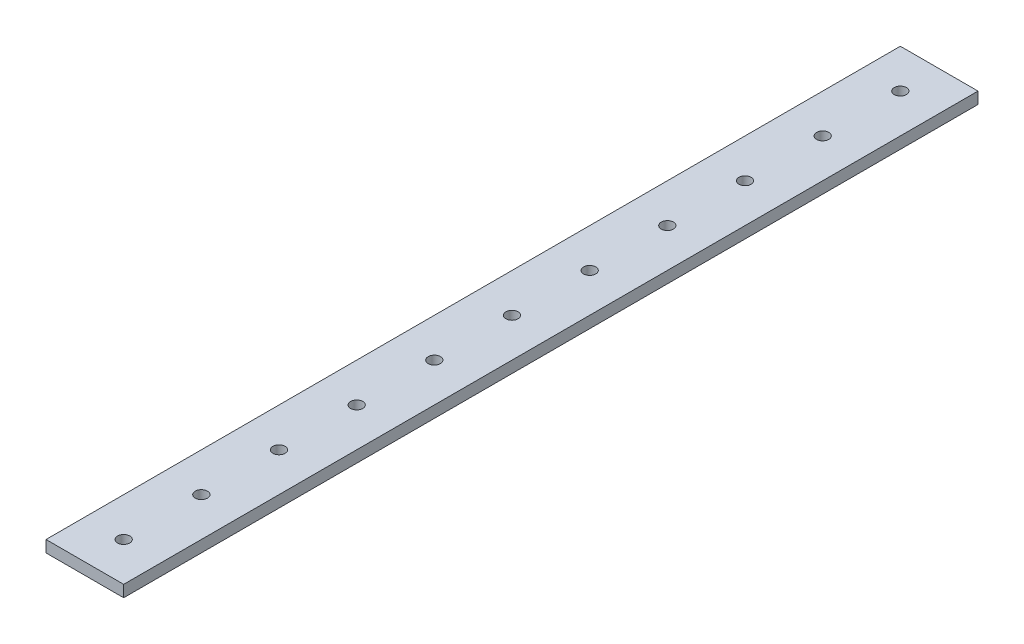
ISO-10303-21;
HEADER;
FILE_DESCRIPTION(('STEP AP214'),'2;1');
FILE_NAME('part.step','',(''),(''),'','','');
FILE_SCHEMA(('AUTOMOTIVE_DESIGN { 1 0 10303 214 1 1 1 1 }'));
ENDSEC;
DATA;
#1=APPLICATION_CONTEXT('core data for automotive mechanical design processes');
#2=APPLICATION_PROTOCOL_DEFINITION('international standard','automotive_design',2000,#1);
#3=PRODUCT_CONTEXT('',#1,'mechanical');
#4=PRODUCT('Part','Part','',(#3));
#5=PRODUCT_RELATED_PRODUCT_CATEGORY('part','',(#4));
#6=PRODUCT_DEFINITION_FORMATION('','',#4);
#7=PRODUCT_DEFINITION_CONTEXT('part definition',#1,'design');
#8=PRODUCT_DEFINITION('design','',#6,#7);
#9=PRODUCT_DEFINITION_SHAPE('','',#8);
#10=(LENGTH_UNIT() NAMED_UNIT(*) SI_UNIT(.MILLI.,.METRE.));
#11=(NAMED_UNIT(*) PLANE_ANGLE_UNIT() SI_UNIT($,.RADIAN.));
#12=(NAMED_UNIT(*) SI_UNIT($,.STERADIAN.) SOLID_ANGLE_UNIT());
#13=UNCERTAINTY_MEASURE_WITH_UNIT(LENGTH_MEASURE(1.E-05),#10,'distance_accuracy_value','');
#14=(GEOMETRIC_REPRESENTATION_CONTEXT(3) GLOBAL_UNCERTAINTY_ASSIGNED_CONTEXT((#13)) GLOBAL_UNIT_ASSIGNED_CONTEXT((#10,
#11,#12)) REPRESENTATION_CONTEXT('',''));
#15=CARTESIAN_POINT('',(0.,0.,0.));
#16=DIRECTION('',(0.,0.,1.));
#17=DIRECTION('',(1.,0.,0.));
#18=AXIS2_PLACEMENT_3D('',#15,#16,#17);
#19=CARTESIAN_POINT('',(0.,0.,220.));
#20=DIRECTION('',(1.,0.,0.));
#21=DIRECTION('',(0.,1.,0.));
#22=AXIS2_PLACEMENT_3D('',#19,#20,#21);
#23=PLANE('',#22);
#24=DIRECTION('',(0.,-1.,0.));
#25=VECTOR('',#24,1.);
#26=CARTESIAN_POINT('',(0.,0.,0.));
#27=LINE('',#26,#25);
#28=CARTESIAN_POINT('',(0.,0.,0.));
#29=VERTEX_POINT('',#28);
#30=CARTESIAN_POINT('',(0.,-3.,0.));
#31=VERTEX_POINT('',#30);
#32=EDGE_CURVE('E111',#29,#31,#27,.T.);
#33=ORIENTED_EDGE('',*,*,#32,.T.);
#34=DIRECTION('',(0.,0.,-1.));
#35=VECTOR('',#34,1.);
#36=CARTESIAN_POINT('',(0.,-3.,220.));
#37=LINE('',#36,#35);
#38=CARTESIAN_POINT('',(0.,-3.,220.));
#39=VERTEX_POINT('',#38);
#40=EDGE_CURVE('E11',#39,#31,#37,.T.);
#41=ORIENTED_EDGE('',*,*,#40,.F.);
#42=DIRECTION('',(0.,-1.,0.));
#43=VECTOR('',#42,1.);
#44=CARTESIAN_POINT('',(0.,0.,220.));
#45=LINE('',#44,#43);
#46=CARTESIAN_POINT('',(0.,0.,220.));
#47=VERTEX_POINT('',#46);
#48=EDGE_CURVE('E95',#47,#39,#45,.T.);
#49=ORIENTED_EDGE('',*,*,#48,.F.);
#50=DIRECTION('',(0.,0.,-1.));
#51=VECTOR('',#50,1.);
#52=CARTESIAN_POINT('',(0.,0.,220.));
#53=LINE('',#52,#51);
#54=EDGE_CURVE('E107',#47,#29,#53,.T.);
#55=ORIENTED_EDGE('',*,*,#54,.T.);
#56=EDGE_LOOP('',(#33,#41,#49,#55));
#57=FACE_BOUND('',#56,.T.);
#58=ADVANCED_FACE('F43',(#57),#23,.F.);
#59=CARTESIAN_POINT('',(0.,-3.,220.));
#60=DIRECTION('',(0.,1.,0.));
#61=DIRECTION('',(0.,0.,1.));
#62=AXIS2_PLACEMENT_3D('',#59,#60,#61);
#63=PLANE('',#62);
#64=CARTESIAN_POINT('',(10.,-3.,10.));
#65=DIRECTION('',(0.,1.,0.));
#66=DIRECTION('',(0.,0.,1.));
#67=AXIS2_PLACEMENT_3D('',#64,#65,#66);
#68=CIRCLE('',#67,1.575);
#69=CARTESIAN_POINT('',(10.,-3.,11.575));
#70=VERTEX_POINT('',#69);
#71=EDGE_CURVE('E115',#70,#70,#68,.T.);
#72=ORIENTED_EDGE('',*,*,#71,.T.);
#73=EDGE_LOOP('',(#72));
#74=FACE_BOUND('',#73,.T.);
#75=CARTESIAN_POINT('',(10.,-3.,30.));
#76=DIRECTION('',(0.,1.,0.));
#77=DIRECTION('',(0.,0.,1.));
#78=AXIS2_PLACEMENT_3D('',#75,#76,#77);
#79=CIRCLE('',#78,1.575);
#80=CARTESIAN_POINT('',(10.,-3.,31.575));
#81=VERTEX_POINT('',#80);
#82=EDGE_CURVE('E204',#81,#81,#79,.T.);
#83=ORIENTED_EDGE('',*,*,#82,.T.);
#84=EDGE_LOOP('',(#83));
#85=FACE_BOUND('',#84,.T.);
#86=CARTESIAN_POINT('',(10.,-3.,50.));
#87=DIRECTION('',(0.,1.,0.));
#88=DIRECTION('',(0.,0.,1.));
#89=AXIS2_PLACEMENT_3D('',#86,#87,#88);
#90=CIRCLE('',#89,1.575);
#91=CARTESIAN_POINT('',(10.,-3.,51.575));
#92=VERTEX_POINT('',#91);
#93=EDGE_CURVE('E196',#92,#92,#90,.T.);
#94=ORIENTED_EDGE('',*,*,#93,.T.);
#95=EDGE_LOOP('',(#94));
#96=FACE_BOUND('',#95,.T.);
#97=CARTESIAN_POINT('',(10.,-3.,70.));
#98=DIRECTION('',(0.,1.,0.));
#99=DIRECTION('',(0.,0.,1.));
#100=AXIS2_PLACEMENT_3D('',#97,#98,#99);
#101=CIRCLE('',#100,1.575);
#102=CARTESIAN_POINT('',(10.,-3.,71.575));
#103=VERTEX_POINT('',#102);
#104=EDGE_CURVE('E188',#103,#103,#101,.T.);
#105=ORIENTED_EDGE('',*,*,#104,.T.);
#106=EDGE_LOOP('',(#105));
#107=FACE_BOUND('',#106,.T.);
#108=CARTESIAN_POINT('',(10.,-3.,90.));
#109=DIRECTION('',(0.,1.,0.));
#110=DIRECTION('',(0.,0.,1.));
#111=AXIS2_PLACEMENT_3D('',#108,#109,#110);
#112=CIRCLE('',#111,1.575);
#113=CARTESIAN_POINT('',(10.,-3.,91.575));
#114=VERTEX_POINT('',#113);
#115=EDGE_CURVE('E180',#114,#114,#112,.T.);
#116=ORIENTED_EDGE('',*,*,#115,.T.);
#117=EDGE_LOOP('',(#116));
#118=FACE_BOUND('',#117,.T.);
#119=CARTESIAN_POINT('',(10.,-3.,110.));
#120=DIRECTION('',(0.,1.,0.));
#121=DIRECTION('',(0.,0.,1.));
#122=AXIS2_PLACEMENT_3D('',#119,#120,#121);
#123=CIRCLE('',#122,1.575);
#124=CARTESIAN_POINT('',(10.,-3.,111.575));
#125=VERTEX_POINT('',#124);
#126=EDGE_CURVE('E172',#125,#125,#123,.T.);
#127=ORIENTED_EDGE('',*,*,#126,.T.);
#128=EDGE_LOOP('',(#127));
#129=FACE_BOUND('',#128,.T.);
#130=CARTESIAN_POINT('',(10.,-3.,130.));
#131=DIRECTION('',(0.,1.,0.));
#132=DIRECTION('',(0.,0.,1.));
#133=AXIS2_PLACEMENT_3D('',#130,#131,#132);
#134=CIRCLE('',#133,1.575);
#135=CARTESIAN_POINT('',(10.,-3.,131.575));
#136=VERTEX_POINT('',#135);
#137=EDGE_CURVE('E164',#136,#136,#134,.T.);
#138=ORIENTED_EDGE('',*,*,#137,.T.);
#139=EDGE_LOOP('',(#138));
#140=FACE_BOUND('',#139,.T.);
#141=CARTESIAN_POINT('',(10.,-3.,150.));
#142=DIRECTION('',(0.,1.,0.));
#143=DIRECTION('',(0.,0.,1.));
#144=AXIS2_PLACEMENT_3D('',#141,#142,#143);
#145=CIRCLE('',#144,1.575);
#146=CARTESIAN_POINT('',(10.,-3.,151.575));
#147=VERTEX_POINT('',#146);
#148=EDGE_CURVE('E156',#147,#147,#145,.T.);
#149=ORIENTED_EDGE('',*,*,#148,.T.);
#150=EDGE_LOOP('',(#149));
#151=FACE_BOUND('',#150,.T.);
#152=CARTESIAN_POINT('',(10.,-3.,170.));
#153=DIRECTION('',(0.,1.,0.));
#154=DIRECTION('',(0.,0.,1.));
#155=AXIS2_PLACEMENT_3D('',#152,#153,#154);
#156=CIRCLE('',#155,1.575);
#157=CARTESIAN_POINT('',(10.,-3.,171.575));
#158=VERTEX_POINT('',#157);
#159=EDGE_CURVE('E148',#158,#158,#156,.T.);
#160=ORIENTED_EDGE('',*,*,#159,.T.);
#161=EDGE_LOOP('',(#160));
#162=FACE_BOUND('',#161,.T.);
#163=CARTESIAN_POINT('',(10.,-3.,190.));
#164=DIRECTION('',(0.,1.,0.));
#165=DIRECTION('',(0.,0.,1.));
#166=AXIS2_PLACEMENT_3D('',#163,#164,#165);
#167=CIRCLE('',#166,1.575);
#168=CARTESIAN_POINT('',(10.,-3.,191.575));
#169=VERTEX_POINT('',#168);
#170=EDGE_CURVE('E140',#169,#169,#167,.T.);
#171=ORIENTED_EDGE('',*,*,#170,.T.);
#172=EDGE_LOOP('',(#171));
#173=FACE_BOUND('',#172,.T.);
#174=CARTESIAN_POINT('',(10.,-3.,210.));
#175=DIRECTION('',(0.,1.,0.));
#176=DIRECTION('',(0.,0.,1.));
#177=AXIS2_PLACEMENT_3D('',#174,#175,#176);
#178=CIRCLE('',#177,1.575);
#179=CARTESIAN_POINT('',(10.,-3.,211.575));
#180=VERTEX_POINT('',#179);
#181=EDGE_CURVE('E132',#180,#180,#178,.T.);
#182=ORIENTED_EDGE('',*,*,#181,.T.);
#183=EDGE_LOOP('',(#182));
#184=FACE_BOUND('',#183,.T.);
#185=DIRECTION('',(1.,0.,0.));
#186=VECTOR('',#185,1.);
#187=CARTESIAN_POINT('',(0.,-3.,0.));
#188=LINE('',#187,#186);
#189=CARTESIAN_POINT('',(20.,-3.,0.));
#190=VERTEX_POINT('',#189);
#191=EDGE_CURVE('E100',#31,#190,#188,.T.);
#192=ORIENTED_EDGE('',*,*,#191,.T.);
#193=DIRECTION('',(0.,0.,-1.));
#194=VECTOR('',#193,1.);
#195=CARTESIAN_POINT('',(20.,-3.,220.));
#196=LINE('',#195,#194);
#197=CARTESIAN_POINT('',(20.,-3.,220.));
#198=VERTEX_POINT('',#197);
#199=EDGE_CURVE('E52',#198,#190,#196,.T.);
#200=ORIENTED_EDGE('',*,*,#199,.F.);
#201=DIRECTION('',(1.,0.,0.));
#202=VECTOR('',#201,1.);
#203=CARTESIAN_POINT('',(0.,-3.,220.));
#204=LINE('',#203,#202);
#205=EDGE_CURVE('E90',#39,#198,#204,.T.);
#206=ORIENTED_EDGE('',*,*,#205,.F.);
#207=ORIENTED_EDGE('',*,*,#40,.T.);
#208=EDGE_LOOP('',(#192,#200,#206,#207));
#209=FACE_BOUND('',#208,.T.);
#210=ADVANCED_FACE('F99',(#74,#85,#96,#107,#118,#129,#140,#151,#162,#173,#184,#209),#63,.F.);
#211=CARTESIAN_POINT('',(20.,0.,220.));
#212=DIRECTION('',(-1.,0.,0.));
#213=DIRECTION('',(0.,-1.,0.));
#214=AXIS2_PLACEMENT_3D('',#211,#212,#213);
#215=PLANE('',#214);
#216=DIRECTION('',(0.,1.,0.));
#217=VECTOR('',#216,1.);
#218=CARTESIAN_POINT('',(20.,0.,0.));
#219=LINE('',#218,#217);
#220=CARTESIAN_POINT('',(20.,0.,0.));
#221=VERTEX_POINT('',#220);
#222=EDGE_CURVE('E77',#190,#221,#219,.T.);
#223=ORIENTED_EDGE('',*,*,#222,.T.);
#224=DIRECTION('',(0.,0.,-1.));
#225=VECTOR('',#224,1.);
#226=CARTESIAN_POINT('',(20.,0.,220.));
#227=LINE('',#226,#225);
#228=CARTESIAN_POINT('',(20.,0.,220.));
#229=VERTEX_POINT('',#228);
#230=EDGE_CURVE('E102',#229,#221,#227,.T.);
#231=ORIENTED_EDGE('',*,*,#230,.F.);
#232=DIRECTION('',(0.,1.,0.));
#233=VECTOR('',#232,1.);
#234=CARTESIAN_POINT('',(20.,0.,220.));
#235=LINE('',#234,#233);
#236=EDGE_CURVE('E93',#198,#229,#235,.T.);
#237=ORIENTED_EDGE('',*,*,#236,.F.);
#238=ORIENTED_EDGE('',*,*,#199,.T.);
#239=EDGE_LOOP('',(#223,#231,#237,#238));
#240=FACE_BOUND('',#239,.T.);
#241=ADVANCED_FACE('F103',(#240),#215,.F.);
#242=CARTESIAN_POINT('',(0.,0.,220.));
#243=DIRECTION('',(0.,-1.,0.));
#244=DIRECTION('',(0.,0.,-1.));
#245=AXIS2_PLACEMENT_3D('',#242,#243,#244);
#246=PLANE('',#245);
#247=CARTESIAN_POINT('',(10.,0.,10.));
#248=DIRECTION('',(0.,1.,0.));
#249=DIRECTION('',(0.,0.,1.));
#250=AXIS2_PLACEMENT_3D('',#247,#248,#249);
#251=CIRCLE('',#250,1.575);
#252=CARTESIAN_POINT('',(10.,0.,11.575));
#253=VERTEX_POINT('',#252);
#254=EDGE_CURVE('E212',#253,#253,#251,.T.);
#255=ORIENTED_EDGE('',*,*,#254,.F.);
#256=EDGE_LOOP('',(#255));
#257=FACE_BOUND('',#256,.T.);
#258=CARTESIAN_POINT('',(10.,0.,30.));
#259=DIRECTION('',(0.,1.,0.));
#260=DIRECTION('',(0.,0.,1.));
#261=AXIS2_PLACEMENT_3D('',#258,#259,#260);
#262=CIRCLE('',#261,1.575);
#263=CARTESIAN_POINT('',(10.,0.,31.575));
#264=VERTEX_POINT('',#263);
#265=EDGE_CURVE('E208',#264,#264,#262,.T.);
#266=ORIENTED_EDGE('',*,*,#265,.F.);
#267=EDGE_LOOP('',(#266));
#268=FACE_BOUND('',#267,.T.);
#269=CARTESIAN_POINT('',(10.,0.,50.));
#270=DIRECTION('',(0.,1.,0.));
#271=DIRECTION('',(0.,0.,1.));
#272=AXIS2_PLACEMENT_3D('',#269,#270,#271);
#273=CIRCLE('',#272,1.575);
#274=CARTESIAN_POINT('',(10.,0.,51.575));
#275=VERTEX_POINT('',#274);
#276=EDGE_CURVE('E200',#275,#275,#273,.T.);
#277=ORIENTED_EDGE('',*,*,#276,.F.);
#278=EDGE_LOOP('',(#277));
#279=FACE_BOUND('',#278,.T.);
#280=CARTESIAN_POINT('',(10.,0.,70.));
#281=DIRECTION('',(0.,1.,0.));
#282=DIRECTION('',(0.,0.,1.));
#283=AXIS2_PLACEMENT_3D('',#280,#281,#282);
#284=CIRCLE('',#283,1.575);
#285=CARTESIAN_POINT('',(10.,0.,71.575));
#286=VERTEX_POINT('',#285);
#287=EDGE_CURVE('E192',#286,#286,#284,.T.);
#288=ORIENTED_EDGE('',*,*,#287,.F.);
#289=EDGE_LOOP('',(#288));
#290=FACE_BOUND('',#289,.T.);
#291=CARTESIAN_POINT('',(10.,0.,90.));
#292=DIRECTION('',(0.,1.,0.));
#293=DIRECTION('',(0.,0.,1.));
#294=AXIS2_PLACEMENT_3D('',#291,#292,#293);
#295=CIRCLE('',#294,1.575);
#296=CARTESIAN_POINT('',(10.,0.,91.575));
#297=VERTEX_POINT('',#296);
#298=EDGE_CURVE('E184',#297,#297,#295,.T.);
#299=ORIENTED_EDGE('',*,*,#298,.F.);
#300=EDGE_LOOP('',(#299));
#301=FACE_BOUND('',#300,.T.);
#302=CARTESIAN_POINT('',(10.,0.,110.));
#303=DIRECTION('',(0.,1.,0.));
#304=DIRECTION('',(0.,0.,1.));
#305=AXIS2_PLACEMENT_3D('',#302,#303,#304);
#306=CIRCLE('',#305,1.575);
#307=CARTESIAN_POINT('',(10.,0.,111.575));
#308=VERTEX_POINT('',#307);
#309=EDGE_CURVE('E176',#308,#308,#306,.T.);
#310=ORIENTED_EDGE('',*,*,#309,.F.);
#311=EDGE_LOOP('',(#310));
#312=FACE_BOUND('',#311,.T.);
#313=CARTESIAN_POINT('',(10.,0.,130.));
#314=DIRECTION('',(0.,1.,0.));
#315=DIRECTION('',(0.,0.,1.));
#316=AXIS2_PLACEMENT_3D('',#313,#314,#315);
#317=CIRCLE('',#316,1.575);
#318=CARTESIAN_POINT('',(10.,0.,131.575));
#319=VERTEX_POINT('',#318);
#320=EDGE_CURVE('E168',#319,#319,#317,.T.);
#321=ORIENTED_EDGE('',*,*,#320,.F.);
#322=EDGE_LOOP('',(#321));
#323=FACE_BOUND('',#322,.T.);
#324=CARTESIAN_POINT('',(10.,0.,150.));
#325=DIRECTION('',(0.,1.,0.));
#326=DIRECTION('',(0.,0.,1.));
#327=AXIS2_PLACEMENT_3D('',#324,#325,#326);
#328=CIRCLE('',#327,1.575);
#329=CARTESIAN_POINT('',(10.,0.,151.575));
#330=VERTEX_POINT('',#329);
#331=EDGE_CURVE('E160',#330,#330,#328,.T.);
#332=ORIENTED_EDGE('',*,*,#331,.F.);
#333=EDGE_LOOP('',(#332));
#334=FACE_BOUND('',#333,.T.);
#335=CARTESIAN_POINT('',(10.,0.,170.));
#336=DIRECTION('',(0.,1.,0.));
#337=DIRECTION('',(0.,0.,1.));
#338=AXIS2_PLACEMENT_3D('',#335,#336,#337);
#339=CIRCLE('',#338,1.575);
#340=CARTESIAN_POINT('',(10.,0.,171.575));
#341=VERTEX_POINT('',#340);
#342=EDGE_CURVE('E152',#341,#341,#339,.T.);
#343=ORIENTED_EDGE('',*,*,#342,.F.);
#344=EDGE_LOOP('',(#343));
#345=FACE_BOUND('',#344,.T.);
#346=CARTESIAN_POINT('',(10.,0.,190.));
#347=DIRECTION('',(0.,1.,0.));
#348=DIRECTION('',(0.,0.,1.));
#349=AXIS2_PLACEMENT_3D('',#346,#347,#348);
#350=CIRCLE('',#349,1.575);
#351=CARTESIAN_POINT('',(10.,0.,191.575));
#352=VERTEX_POINT('',#351);
#353=EDGE_CURVE('E144',#352,#352,#350,.T.);
#354=ORIENTED_EDGE('',*,*,#353,.F.);
#355=EDGE_LOOP('',(#354));
#356=FACE_BOUND('',#355,.T.);
#357=CARTESIAN_POINT('',(10.,0.,210.));
#358=DIRECTION('',(0.,1.,0.));
#359=DIRECTION('',(0.,0.,1.));
#360=AXIS2_PLACEMENT_3D('',#357,#358,#359);
#361=CIRCLE('',#360,1.575);
#362=CARTESIAN_POINT('',(10.,0.,211.575));
#363=VERTEX_POINT('',#362);
#364=EDGE_CURVE('E136',#363,#363,#361,.T.);
#365=ORIENTED_EDGE('',*,*,#364,.F.);
#366=EDGE_LOOP('',(#365));
#367=FACE_BOUND('',#366,.T.);
#368=DIRECTION('',(-1.,0.,0.));
#369=VECTOR('',#368,1.);
#370=CARTESIAN_POINT('',(0.,0.,0.));
#371=LINE('',#370,#369);
#372=EDGE_CURVE('E83',#221,#29,#371,.T.);
#373=ORIENTED_EDGE('',*,*,#372,.T.);
#374=ORIENTED_EDGE('',*,*,#54,.F.);
#375=DIRECTION('',(-1.,0.,0.));
#376=VECTOR('',#375,1.);
#377=CARTESIAN_POINT('',(0.,0.,220.));
#378=LINE('',#377,#376);
#379=EDGE_CURVE('E60',#229,#47,#378,.T.);
#380=ORIENTED_EDGE('',*,*,#379,.F.);
#381=ORIENTED_EDGE('',*,*,#230,.T.);
#382=EDGE_LOOP('',(#373,#374,#380,#381));
#383=FACE_BOUND('',#382,.T.);
#384=ADVANCED_FACE('F125',(#257,#268,#279,#290,#301,#312,#323,#334,#345,#356,#367,#383),#246,.F.);
#385=CARTESIAN_POINT('',(0.,0.,220.));
#386=DIRECTION('',(0.,0.,1.));
#387=DIRECTION('',(1.,0.,0.));
#388=AXIS2_PLACEMENT_3D('',#385,#386,#387);
#389=PLANE('',#388);
#390=ORIENTED_EDGE('',*,*,#48,.T.);
#391=ORIENTED_EDGE('',*,*,#205,.T.);
#392=ORIENTED_EDGE('',*,*,#236,.T.);
#393=ORIENTED_EDGE('',*,*,#379,.T.);
#394=EDGE_LOOP('',(#390,#391,#392,#393));
#395=FACE_BOUND('',#394,.T.);
#396=ADVANCED_FACE('F91',(#395),#389,.T.);
#397=CARTESIAN_POINT('',(0.,0.,0.));
#398=DIRECTION('',(0.,0.,1.));
#399=DIRECTION('',(1.,0.,0.));
#400=AXIS2_PLACEMENT_3D('',#397,#398,#399);
#401=PLANE('',#400);
#402=ORIENTED_EDGE('',*,*,#32,.F.);
#403=ORIENTED_EDGE('',*,*,#372,.F.);
#404=ORIENTED_EDGE('',*,*,#222,.F.);
#405=ORIENTED_EDGE('',*,*,#191,.F.);
#406=EDGE_LOOP('',(#402,#403,#404,#405));
#407=FACE_BOUND('',#406,.T.);
#408=ADVANCED_FACE('F128',(#407),#401,.F.);
#409=CARTESIAN_POINT('',(10.,-3.,210.));
#410=DIRECTION('',(0.,1.,0.));
#411=DIRECTION('',(0.,0.,1.));
#412=AXIS2_PLACEMENT_3D('',#409,#410,#411);
#413=CYLINDRICAL_SURFACE('',#412,1.575);
#414=ORIENTED_EDGE('',*,*,#181,.F.);
#415=EDGE_LOOP('',(#414));
#416=FACE_BOUND('',#415,.T.);
#417=ORIENTED_EDGE('',*,*,#364,.T.);
#418=EDGE_LOOP('',(#417));
#419=FACE_BOUND('',#418,.T.);
#420=ADVANCED_FACE('F252',(#416,#419),#413,.F.);
#421=CARTESIAN_POINT('',(10.,-3.,190.));
#422=DIRECTION('',(0.,1.,0.));
#423=DIRECTION('',(0.,0.,1.));
#424=AXIS2_PLACEMENT_3D('',#421,#422,#423);
#425=CYLINDRICAL_SURFACE('',#424,1.575);
#426=ORIENTED_EDGE('',*,*,#170,.F.);
#427=EDGE_LOOP('',(#426));
#428=FACE_BOUND('',#427,.T.);
#429=ORIENTED_EDGE('',*,*,#353,.T.);
#430=EDGE_LOOP('',(#429));
#431=FACE_BOUND('',#430,.T.);
#432=ADVANCED_FACE('F254',(#428,#431),#425,.F.);
#433=CARTESIAN_POINT('',(10.,-3.,170.));
#434=DIRECTION('',(0.,1.,0.));
#435=DIRECTION('',(0.,0.,1.));
#436=AXIS2_PLACEMENT_3D('',#433,#434,#435);
#437=CYLINDRICAL_SURFACE('',#436,1.575);
#438=ORIENTED_EDGE('',*,*,#159,.F.);
#439=EDGE_LOOP('',(#438));
#440=FACE_BOUND('',#439,.T.);
#441=ORIENTED_EDGE('',*,*,#342,.T.);
#442=EDGE_LOOP('',(#441));
#443=FACE_BOUND('',#442,.T.);
#444=ADVANCED_FACE('F261',(#440,#443),#437,.F.);
#445=CARTESIAN_POINT('',(10.,-3.,150.));
#446=DIRECTION('',(0.,1.,0.));
#447=DIRECTION('',(0.,0.,1.));
#448=AXIS2_PLACEMENT_3D('',#445,#446,#447);
#449=CYLINDRICAL_SURFACE('',#448,1.575);
#450=ORIENTED_EDGE('',*,*,#148,.F.);
#451=EDGE_LOOP('',(#450));
#452=FACE_BOUND('',#451,.T.);
#453=ORIENTED_EDGE('',*,*,#331,.T.);
#454=EDGE_LOOP('',(#453));
#455=FACE_BOUND('',#454,.T.);
#456=ADVANCED_FACE('F319',(#452,#455),#449,.F.);
#457=CARTESIAN_POINT('',(10.,-3.,130.));
#458=DIRECTION('',(0.,1.,0.));
#459=DIRECTION('',(0.,0.,1.));
#460=AXIS2_PLACEMENT_3D('',#457,#458,#459);
#461=CYLINDRICAL_SURFACE('',#460,1.575);
#462=ORIENTED_EDGE('',*,*,#137,.F.);
#463=EDGE_LOOP('',(#462));
#464=FACE_BOUND('',#463,.T.);
#465=ORIENTED_EDGE('',*,*,#320,.T.);
#466=EDGE_LOOP('',(#465));
#467=FACE_BOUND('',#466,.T.);
#468=ADVANCED_FACE('F330',(#464,#467),#461,.F.);
#469=CARTESIAN_POINT('',(10.,-3.,110.));
#470=DIRECTION('',(0.,1.,0.));
#471=DIRECTION('',(0.,0.,1.));
#472=AXIS2_PLACEMENT_3D('',#469,#470,#471);
#473=CYLINDRICAL_SURFACE('',#472,1.575);
#474=ORIENTED_EDGE('',*,*,#126,.F.);
#475=EDGE_LOOP('',(#474));
#476=FACE_BOUND('',#475,.T.);
#477=ORIENTED_EDGE('',*,*,#309,.T.);
#478=EDGE_LOOP('',(#477));
#479=FACE_BOUND('',#478,.T.);
#480=ADVANCED_FACE('F341',(#476,#479),#473,.F.);
#481=CARTESIAN_POINT('',(10.,-3.,90.));
#482=DIRECTION('',(0.,1.,0.));
#483=DIRECTION('',(0.,0.,1.));
#484=AXIS2_PLACEMENT_3D('',#481,#482,#483);
#485=CYLINDRICAL_SURFACE('',#484,1.575);
#486=ORIENTED_EDGE('',*,*,#115,.F.);
#487=EDGE_LOOP('',(#486));
#488=FACE_BOUND('',#487,.T.);
#489=ORIENTED_EDGE('',*,*,#298,.T.);
#490=EDGE_LOOP('',(#489));
#491=FACE_BOUND('',#490,.T.);
#492=ADVANCED_FACE('F352',(#488,#491),#485,.F.);
#493=CARTESIAN_POINT('',(10.,-3.,70.));
#494=DIRECTION('',(0.,1.,0.));
#495=DIRECTION('',(0.,0.,1.));
#496=AXIS2_PLACEMENT_3D('',#493,#494,#495);
#497=CYLINDRICAL_SURFACE('',#496,1.575);
#498=ORIENTED_EDGE('',*,*,#104,.F.);
#499=EDGE_LOOP('',(#498));
#500=FACE_BOUND('',#499,.T.);
#501=ORIENTED_EDGE('',*,*,#287,.T.);
#502=EDGE_LOOP('',(#501));
#503=FACE_BOUND('',#502,.T.);
#504=ADVANCED_FACE('F363',(#500,#503),#497,.F.);
#505=CARTESIAN_POINT('',(10.,-3.,50.));
#506=DIRECTION('',(0.,1.,0.));
#507=DIRECTION('',(0.,0.,1.));
#508=AXIS2_PLACEMENT_3D('',#505,#506,#507);
#509=CYLINDRICAL_SURFACE('',#508,1.575);
#510=ORIENTED_EDGE('',*,*,#93,.F.);
#511=EDGE_LOOP('',(#510));
#512=FACE_BOUND('',#511,.T.);
#513=ORIENTED_EDGE('',*,*,#276,.T.);
#514=EDGE_LOOP('',(#513));
#515=FACE_BOUND('',#514,.T.);
#516=ADVANCED_FACE('F374',(#512,#515),#509,.F.);
#517=CARTESIAN_POINT('',(10.,-3.,30.));
#518=DIRECTION('',(0.,1.,0.));
#519=DIRECTION('',(0.,0.,1.));
#520=AXIS2_PLACEMENT_3D('',#517,#518,#519);
#521=CYLINDRICAL_SURFACE('',#520,1.575);
#522=ORIENTED_EDGE('',*,*,#82,.F.);
#523=EDGE_LOOP('',(#522));
#524=FACE_BOUND('',#523,.T.);
#525=ORIENTED_EDGE('',*,*,#265,.T.);
#526=EDGE_LOOP('',(#525));
#527=FACE_BOUND('',#526,.T.);
#528=ADVANCED_FACE('F225',(#524,#527),#521,.F.);
#529=CARTESIAN_POINT('',(10.,-3.,10.));
#530=DIRECTION('',(0.,1.,0.));
#531=DIRECTION('',(0.,0.,1.));
#532=AXIS2_PLACEMENT_3D('',#529,#530,#531);
#533=CYLINDRICAL_SURFACE('',#532,1.575);
#534=ORIENTED_EDGE('',*,*,#71,.F.);
#535=EDGE_LOOP('',(#534));
#536=FACE_BOUND('',#535,.T.);
#537=ORIENTED_EDGE('',*,*,#254,.T.);
#538=EDGE_LOOP('',(#537));
#539=FACE_BOUND('',#538,.T.);
#540=ADVANCED_FACE('F222',(#536,#539),#533,.F.);
#541=CLOSED_SHELL('',(#58,#210,#241,#384,#396,#408,#420,#432,#444,#456,#468,#480,#492,#504,#516,
#528,#540));
#542=MANIFOLD_SOLID_BREP('B2',#541);
#543=ADVANCED_BREP_SHAPE_REPRESENTATION('',(#18,#542),#14);
#544=SHAPE_DEFINITION_REPRESENTATION(#9,#543);
ENDSEC;
END-ISO-10303-21;
